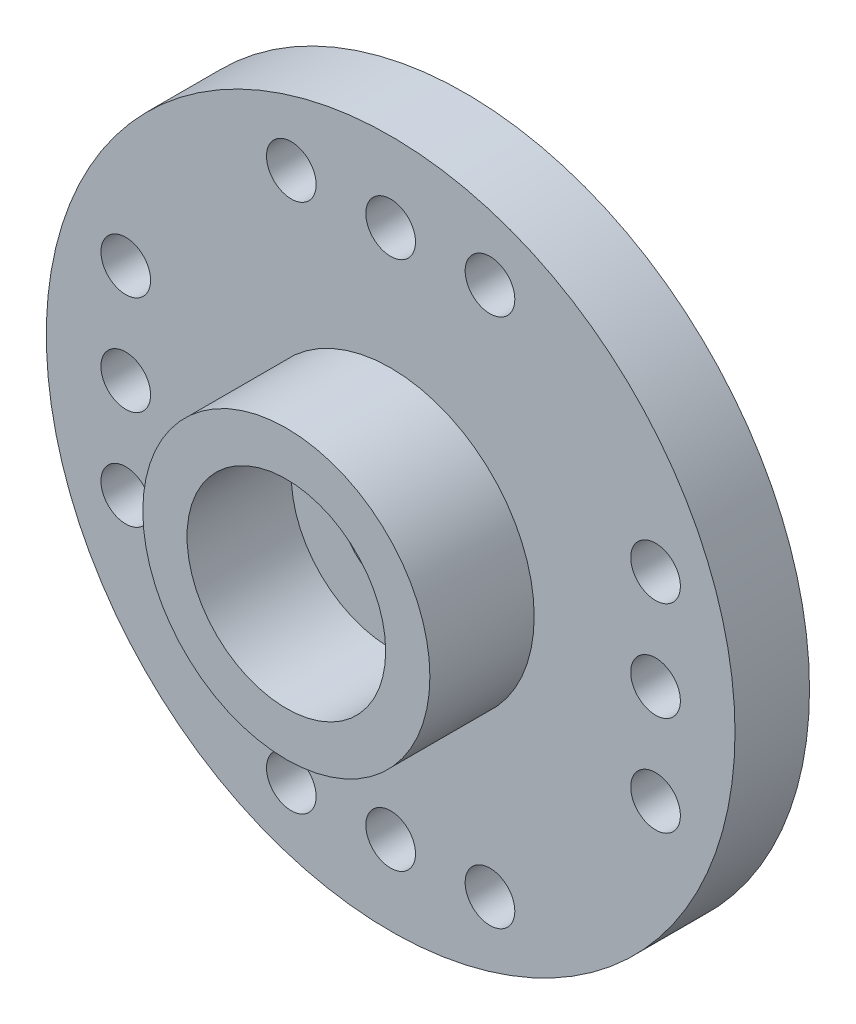
ISO-10303-21;
HEADER;
FILE_DESCRIPTION(('STEP AP214'),'2;1');
FILE_NAME('part.step','',(''),(''),'','','');
FILE_SCHEMA(('AUTOMOTIVE_DESIGN { 1 0 10303 214 1 1 1 1 }'));
ENDSEC;
DATA;
#1=APPLICATION_CONTEXT('core data for automotive mechanical design processes');
#2=APPLICATION_PROTOCOL_DEFINITION('international standard','automotive_design',2000,#1);
#3=PRODUCT_CONTEXT('',#1,'mechanical');
#4=PRODUCT('Part','Part','',(#3));
#5=PRODUCT_RELATED_PRODUCT_CATEGORY('part','',(#4));
#6=PRODUCT_DEFINITION_FORMATION('','',#4);
#7=PRODUCT_DEFINITION_CONTEXT('part definition',#1,'design');
#8=PRODUCT_DEFINITION('design','',#6,#7);
#9=PRODUCT_DEFINITION_SHAPE('','',#8);
#10=(LENGTH_UNIT() NAMED_UNIT(*) SI_UNIT(.MILLI.,.METRE.));
#11=(NAMED_UNIT(*) PLANE_ANGLE_UNIT() SI_UNIT($,.RADIAN.));
#12=(NAMED_UNIT(*) SI_UNIT($,.STERADIAN.) SOLID_ANGLE_UNIT());
#13=UNCERTAINTY_MEASURE_WITH_UNIT(LENGTH_MEASURE(1.E-05),#10,'distance_accuracy_value','');
#14=(GEOMETRIC_REPRESENTATION_CONTEXT(3) GLOBAL_UNCERTAINTY_ASSIGNED_CONTEXT((#13)) GLOBAL_UNIT_ASSIGNED_CONTEXT((#10,
#11,#12)) REPRESENTATION_CONTEXT('',''));
#15=CARTESIAN_POINT('',(0.,0.,0.));
#16=DIRECTION('',(0.,0.,1.));
#17=DIRECTION('',(1.,0.,0.));
#18=AXIS2_PLACEMENT_3D('',#15,#16,#17);
#19=CARTESIAN_POINT('',(0.,0.,2.25));
#20=DIRECTION('',(0.,0.,-1.));
#21=DIRECTION('',(-1.,0.,0.));
#22=AXIS2_PLACEMENT_3D('',#19,#20,#21);
#23=CYLINDRICAL_SURFACE('',#22,10.4);
#24=CARTESIAN_POINT('',(0.,0.,2.25));
#25=DIRECTION('',(0.,0.,1.));
#26=DIRECTION('',(1.,0.,0.));
#27=AXIS2_PLACEMENT_3D('',#24,#25,#26);
#28=CIRCLE('',#27,10.4);
#29=CARTESIAN_POINT('',(10.4,0.,2.25));
#30=VERTEX_POINT('',#29);
#31=EDGE_CURVE('E38',#30,#30,#28,.T.);
#32=ORIENTED_EDGE('',*,*,#31,.F.);
#33=EDGE_LOOP('',(#32));
#34=FACE_BOUND('',#33,.T.);
#35=CARTESIAN_POINT('',(0.,0.,0.));
#36=DIRECTION('',(0.,0.,1.));
#37=DIRECTION('',(1.,0.,0.));
#38=AXIS2_PLACEMENT_3D('',#35,#36,#37);
#39=CIRCLE('',#38,10.4);
#40=CARTESIAN_POINT('',(10.4,0.,0.));
#41=VERTEX_POINT('',#40);
#42=EDGE_CURVE('E43',#41,#41,#39,.T.);
#43=ORIENTED_EDGE('',*,*,#42,.T.);
#44=EDGE_LOOP('',(#43));
#45=FACE_BOUND('',#44,.T.);
#46=ADVANCED_FACE('F31',(#34,#45),#23,.T.);
#47=CARTESIAN_POINT('',(0.,0.,2.25));
#48=DIRECTION('',(0.,0.,1.));
#49=DIRECTION('',(1.,0.,0.));
#50=AXIS2_PLACEMENT_3D('',#47,#48,#49);
#51=PLANE('',#50);
#52=CARTESIAN_POINT('',(-7.9999999999994,-3.00000000000077,2.25));
#53=DIRECTION('',(0.,0.,1.));
#54=DIRECTION('',(1.,0.,0.));
#55=AXIS2_PLACEMENT_3D('',#52,#53,#54);
#56=CIRCLE('',#55,0.750000000000998);
#57=CARTESIAN_POINT('',(-7.24999999999841,-3.00000000000077,2.25));
#58=VERTEX_POINT('',#57);
#59=EDGE_CURVE('E235',#58,#58,#56,.T.);
#60=ORIENTED_EDGE('',*,*,#59,.F.);
#61=EDGE_LOOP('',(#60));
#62=FACE_BOUND('',#61,.T.);
#63=CARTESIAN_POINT('',(-7.99999999999941,2.99999999999923,2.25));
#64=DIRECTION('',(0.,0.,1.));
#65=DIRECTION('',(1.,0.,0.));
#66=AXIS2_PLACEMENT_3D('',#63,#64,#65);
#67=CIRCLE('',#66,0.750000000000978);
#68=CARTESIAN_POINT('',(-7.24999999999843,2.99999999999923,2.25));
#69=VERTEX_POINT('',#68);
#70=EDGE_CURVE('E233',#69,#69,#67,.T.);
#71=ORIENTED_EDGE('',*,*,#70,.F.);
#72=EDGE_LOOP('',(#71));
#73=FACE_BOUND('',#72,.T.);
#74=CARTESIAN_POINT('',(-7.9999999999994,-7.66632617932908E-13,2.25));
#75=DIRECTION('',(0.,0.,1.));
#76=DIRECTION('',(1.,0.,0.));
#77=AXIS2_PLACEMENT_3D('',#74,#75,#76);
#78=CIRCLE('',#77,0.750000000000987);
#79=CARTESIAN_POINT('',(-7.24999999999842,-7.66632617932908E-13,2.25));
#80=VERTEX_POINT('',#79);
#81=EDGE_CURVE('E214',#80,#80,#78,.T.);
#82=ORIENTED_EDGE('',*,*,#81,.F.);
#83=EDGE_LOOP('',(#82));
#84=FACE_BOUND('',#83,.T.);
#85=CARTESIAN_POINT('',(3.,8.,2.25));
#86=DIRECTION('',(0.,0.,1.));
#87=DIRECTION('',(1.,0.,0.));
#88=AXIS2_PLACEMENT_3D('',#85,#86,#87);
#89=CIRCLE('',#88,0.750000000000001);
#90=CARTESIAN_POINT('',(3.75,8.,2.25));
#91=VERTEX_POINT('',#90);
#92=EDGE_CURVE('E220',#91,#91,#89,.T.);
#93=ORIENTED_EDGE('',*,*,#92,.F.);
#94=EDGE_LOOP('',(#93));
#95=FACE_BOUND('',#94,.T.);
#96=CARTESIAN_POINT('',(-3.,8.,2.25));
#97=DIRECTION('',(0.,0.,1.));
#98=DIRECTION('',(1.,0.,0.));
#99=AXIS2_PLACEMENT_3D('',#96,#97,#98);
#100=CIRCLE('',#99,0.750000000000001);
#101=CARTESIAN_POINT('',(-2.25,8.,2.25));
#102=VERTEX_POINT('',#101);
#103=EDGE_CURVE('E223',#102,#102,#100,.T.);
#104=ORIENTED_EDGE('',*,*,#103,.F.);
#105=EDGE_LOOP('',(#104));
#106=FACE_BOUND('',#105,.T.);
#107=CARTESIAN_POINT('',(8.00000000000077,5.95649999847863E-13,2.25));
#108=DIRECTION('',(0.,0.,1.));
#109=DIRECTION('',(1.,0.,0.));
#110=AXIS2_PLACEMENT_3D('',#107,#108,#109);
#111=CIRCLE('',#110,0.750000000000373);
#112=CARTESIAN_POINT('',(8.75000000000114,5.95649999847863E-13,2.25));
#113=VERTEX_POINT('',#112);
#114=EDGE_CURVE('E226',#113,#113,#111,.T.);
#115=ORIENTED_EDGE('',*,*,#114,.F.);
#116=EDGE_LOOP('',(#115));
#117=FACE_BOUND('',#116,.T.);
#118=CARTESIAN_POINT('',(8.00000000000077,-2.9999999999994,2.25));
#119=DIRECTION('',(0.,0.,1.));
#120=DIRECTION('',(1.,0.,0.));
#121=AXIS2_PLACEMENT_3D('',#118,#119,#120);
#122=CIRCLE('',#121,0.75000000000037);
#123=CARTESIAN_POINT('',(8.75000000000114,-2.9999999999994,2.25));
#124=VERTEX_POINT('',#123);
#125=EDGE_CURVE('E218',#124,#124,#122,.T.);
#126=ORIENTED_EDGE('',*,*,#125,.F.);
#127=EDGE_LOOP('',(#126));
#128=FACE_BOUND('',#127,.T.);
#129=CARTESIAN_POINT('',(3.00000000000136,-8.00000000000017,2.25));
#130=DIRECTION('',(0.,0.,1.));
#131=DIRECTION('',(1.,0.,0.));
#132=AXIS2_PLACEMENT_3D('',#129,#130,#131);
#133=CIRCLE('',#132,0.750000000001312);
#134=CARTESIAN_POINT('',(3.75000000000267,-8.00000000000017,2.25));
#135=VERTEX_POINT('',#134);
#136=EDGE_CURVE('E208',#135,#135,#133,.T.);
#137=ORIENTED_EDGE('',*,*,#136,.F.);
#138=EDGE_LOOP('',(#137));
#139=FACE_BOUND('',#138,.T.);
#140=CARTESIAN_POINT('',(-2.99999999999864,-8.00000000000017,2.25));
#141=DIRECTION('',(0.,0.,1.));
#142=DIRECTION('',(1.,0.,0.));
#143=AXIS2_PLACEMENT_3D('',#140,#141,#142);
#144=CIRCLE('',#143,0.7500000000013);
#145=CARTESIAN_POINT('',(-2.24999999999734,-8.00000000000017,2.25));
#146=VERTEX_POINT('',#145);
#147=EDGE_CURVE('E191',#146,#146,#144,.T.);
#148=ORIENTED_EDGE('',*,*,#147,.F.);
#149=EDGE_LOOP('',(#148));
#150=FACE_BOUND('',#149,.T.);
#151=CARTESIAN_POINT('',(1.36130290034145E-12,-8.00000000000017,2.25));
#152=DIRECTION('',(0.,0.,1.));
#153=DIRECTION('',(1.,0.,0.));
#154=AXIS2_PLACEMENT_3D('',#151,#152,#153);
#155=CIRCLE('',#154,0.750000000001306);
#156=CARTESIAN_POINT('',(0.750000000002667,-8.00000000000017,2.25));
#157=VERTEX_POINT('',#156);
#158=EDGE_CURVE('E207',#157,#157,#155,.T.);
#159=ORIENTED_EDGE('',*,*,#158,.F.);
#160=EDGE_LOOP('',(#159));
#161=FACE_BOUND('',#160,.T.);
#162=CARTESIAN_POINT('',(8.00000000000076,3.0000000000006,2.25));
#163=DIRECTION('',(0.,0.,1.));
#164=DIRECTION('',(1.,0.,0.));
#165=AXIS2_PLACEMENT_3D('',#162,#163,#164);
#166=CIRCLE('',#165,0.750000000000377);
#167=CARTESIAN_POINT('',(8.75000000000114,3.0000000000006,2.25));
#168=VERTEX_POINT('',#167);
#169=EDGE_CURVE('E211',#168,#168,#166,.T.);
#170=ORIENTED_EDGE('',*,*,#169,.F.);
#171=EDGE_LOOP('',(#170));
#172=FACE_BOUND('',#171,.T.);
#173=CARTESIAN_POINT('',(0.,8.,2.25));
#174=DIRECTION('',(0.,0.,1.));
#175=DIRECTION('',(1.,0.,0.));
#176=AXIS2_PLACEMENT_3D('',#173,#174,#175);
#177=CIRCLE('',#176,0.75);
#178=CARTESIAN_POINT('',(0.75,8.,2.25));
#179=VERTEX_POINT('',#178);
#180=EDGE_CURVE('E56',#179,#179,#177,.T.);
#181=ORIENTED_EDGE('',*,*,#180,.F.);
#182=EDGE_LOOP('',(#181));
#183=FACE_BOUND('',#182,.T.);
#184=CARTESIAN_POINT('',(0.,0.,2.25));
#185=DIRECTION('',(0.,0.,1.));
#186=DIRECTION('',(1.,0.,0.));
#187=AXIS2_PLACEMENT_3D('',#184,#185,#186);
#188=CIRCLE('',#187,4.335);
#189=CARTESIAN_POINT('',(4.335,0.,2.25));
#190=VERTEX_POINT('',#189);
#191=EDGE_CURVE('E98',#190,#190,#188,.T.);
#192=ORIENTED_EDGE('',*,*,#191,.F.);
#193=EDGE_LOOP('',(#192));
#194=FACE_BOUND('',#193,.T.);
#195=ORIENTED_EDGE('',*,*,#31,.T.);
#196=EDGE_LOOP('',(#195));
#197=FACE_BOUND('',#196,.T.);
#198=ADVANCED_FACE('F107',(#62,#73,#84,#95,#106,#117,#128,#139,#150,#161,#172,#183,#194,#197),
#51,.T.);
#199=CARTESIAN_POINT('',(0.,0.,0.));
#200=DIRECTION('',(0.,0.,1.));
#201=DIRECTION('',(1.,0.,0.));
#202=AXIS2_PLACEMENT_3D('',#199,#200,#201);
#203=PLANE('',#202);
#204=CARTESIAN_POINT('',(-7.9999999999994,-3.00000000000077,0.));
#205=DIRECTION('',(0.,0.,1.));
#206=DIRECTION('',(1.,0.,0.));
#207=AXIS2_PLACEMENT_3D('',#204,#205,#206);
#208=CIRCLE('',#207,0.750000000000998);
#209=CARTESIAN_POINT('',(-7.24999999999841,-3.00000000000077,0.));
#210=VERTEX_POINT('',#209);
#211=EDGE_CURVE('E34',#210,#210,#208,.T.);
#212=ORIENTED_EDGE('',*,*,#211,.T.);
#213=EDGE_LOOP('',(#212));
#214=FACE_BOUND('',#213,.T.);
#215=CARTESIAN_POINT('',(-7.99999999999941,2.99999999999923,0.));
#216=DIRECTION('',(0.,0.,1.));
#217=DIRECTION('',(1.,0.,0.));
#218=AXIS2_PLACEMENT_3D('',#215,#216,#217);
#219=CIRCLE('',#218,0.750000000000978);
#220=CARTESIAN_POINT('',(-7.24999999999843,2.99999999999923,0.));
#221=VERTEX_POINT('',#220);
#222=EDGE_CURVE('E82',#221,#221,#219,.T.);
#223=ORIENTED_EDGE('',*,*,#222,.T.);
#224=EDGE_LOOP('',(#223));
#225=FACE_BOUND('',#224,.T.);
#226=CARTESIAN_POINT('',(-7.9999999999994,-7.66632617932908E-13,0.));
#227=DIRECTION('',(0.,0.,1.));
#228=DIRECTION('',(1.,0.,0.));
#229=AXIS2_PLACEMENT_3D('',#226,#227,#228);
#230=CIRCLE('',#229,0.750000000000987);
#231=CARTESIAN_POINT('',(-7.24999999999842,-7.66632617932908E-13,0.));
#232=VERTEX_POINT('',#231);
#233=EDGE_CURVE('E80',#232,#232,#230,.T.);
#234=ORIENTED_EDGE('',*,*,#233,.T.);
#235=EDGE_LOOP('',(#234));
#236=FACE_BOUND('',#235,.T.);
#237=CARTESIAN_POINT('',(3.,8.,0.));
#238=DIRECTION('',(0.,0.,1.));
#239=DIRECTION('',(1.,0.,0.));
#240=AXIS2_PLACEMENT_3D('',#237,#238,#239);
#241=CIRCLE('',#240,0.750000000000001);
#242=CARTESIAN_POINT('',(3.75,8.,0.));
#243=VERTEX_POINT('',#242);
#244=EDGE_CURVE('E77',#243,#243,#241,.T.);
#245=ORIENTED_EDGE('',*,*,#244,.T.);
#246=EDGE_LOOP('',(#245));
#247=FACE_BOUND('',#246,.T.);
#248=CARTESIAN_POINT('',(-3.,8.,0.));
#249=DIRECTION('',(0.,0.,1.));
#250=DIRECTION('',(1.,0.,0.));
#251=AXIS2_PLACEMENT_3D('',#248,#249,#250);
#252=CIRCLE('',#251,0.750000000000001);
#253=CARTESIAN_POINT('',(-2.25,8.,0.));
#254=VERTEX_POINT('',#253);
#255=EDGE_CURVE('E74',#254,#254,#252,.T.);
#256=ORIENTED_EDGE('',*,*,#255,.T.);
#257=EDGE_LOOP('',(#256));
#258=FACE_BOUND('',#257,.T.);
#259=CARTESIAN_POINT('',(8.00000000000077,5.95649999847863E-13,0.));
#260=DIRECTION('',(0.,0.,1.));
#261=DIRECTION('',(1.,0.,0.));
#262=AXIS2_PLACEMENT_3D('',#259,#260,#261);
#263=CIRCLE('',#262,0.750000000000373);
#264=CARTESIAN_POINT('',(8.75000000000114,5.95649999847863E-13,0.));
#265=VERTEX_POINT('',#264);
#266=EDGE_CURVE('E71',#265,#265,#263,.T.);
#267=ORIENTED_EDGE('',*,*,#266,.T.);
#268=EDGE_LOOP('',(#267));
#269=FACE_BOUND('',#268,.T.);
#270=CARTESIAN_POINT('',(8.00000000000077,-2.9999999999994,0.));
#271=DIRECTION('',(0.,0.,1.));
#272=DIRECTION('',(1.,0.,0.));
#273=AXIS2_PLACEMENT_3D('',#270,#271,#272);
#274=CIRCLE('',#273,0.75000000000037);
#275=CARTESIAN_POINT('',(8.75000000000114,-2.9999999999994,0.));
#276=VERTEX_POINT('',#275);
#277=EDGE_CURVE('E68',#276,#276,#274,.T.);
#278=ORIENTED_EDGE('',*,*,#277,.T.);
#279=EDGE_LOOP('',(#278));
#280=FACE_BOUND('',#279,.T.);
#281=CARTESIAN_POINT('',(3.00000000000136,-8.00000000000017,0.));
#282=DIRECTION('',(0.,0.,1.));
#283=DIRECTION('',(1.,0.,0.));
#284=AXIS2_PLACEMENT_3D('',#281,#282,#283);
#285=CIRCLE('',#284,0.750000000001312);
#286=CARTESIAN_POINT('',(3.75000000000267,-8.00000000000017,0.));
#287=VERTEX_POINT('',#286);
#288=EDGE_CURVE('E65',#287,#287,#285,.T.);
#289=ORIENTED_EDGE('',*,*,#288,.T.);
#290=EDGE_LOOP('',(#289));
#291=FACE_BOUND('',#290,.T.);
#292=CARTESIAN_POINT('',(-2.99999999999864,-8.00000000000017,0.));
#293=DIRECTION('',(0.,0.,1.));
#294=DIRECTION('',(1.,0.,0.));
#295=AXIS2_PLACEMENT_3D('',#292,#293,#294);
#296=CIRCLE('',#295,0.7500000000013);
#297=CARTESIAN_POINT('',(-2.24999999999734,-8.00000000000017,0.));
#298=VERTEX_POINT('',#297);
#299=EDGE_CURVE('E62',#298,#298,#296,.T.);
#300=ORIENTED_EDGE('',*,*,#299,.T.);
#301=EDGE_LOOP('',(#300));
#302=FACE_BOUND('',#301,.T.);
#303=CARTESIAN_POINT('',(1.36130290034145E-12,-8.00000000000017,0.));
#304=DIRECTION('',(0.,0.,1.));
#305=DIRECTION('',(1.,0.,0.));
#306=AXIS2_PLACEMENT_3D('',#303,#304,#305);
#307=CIRCLE('',#306,0.750000000001306);
#308=CARTESIAN_POINT('',(0.750000000002667,-8.00000000000017,0.));
#309=VERTEX_POINT('',#308);
#310=EDGE_CURVE('E59',#309,#309,#307,.T.);
#311=ORIENTED_EDGE('',*,*,#310,.T.);
#312=EDGE_LOOP('',(#311));
#313=FACE_BOUND('',#312,.T.);
#314=CARTESIAN_POINT('',(8.00000000000076,3.0000000000006,0.));
#315=DIRECTION('',(0.,0.,1.));
#316=DIRECTION('',(1.,0.,0.));
#317=AXIS2_PLACEMENT_3D('',#314,#315,#316);
#318=CIRCLE('',#317,0.750000000000377);
#319=CARTESIAN_POINT('',(8.75000000000114,3.0000000000006,0.));
#320=VERTEX_POINT('',#319);
#321=EDGE_CURVE('E55',#320,#320,#318,.T.);
#322=ORIENTED_EDGE('',*,*,#321,.T.);
#323=EDGE_LOOP('',(#322));
#324=FACE_BOUND('',#323,.T.);
#325=CARTESIAN_POINT('',(0.,8.,0.));
#326=DIRECTION('',(0.,0.,1.));
#327=DIRECTION('',(1.,0.,0.));
#328=AXIS2_PLACEMENT_3D('',#325,#326,#327);
#329=CIRCLE('',#328,0.75);
#330=CARTESIAN_POINT('',(0.75,8.,0.));
#331=VERTEX_POINT('',#330);
#332=EDGE_CURVE('E52',#331,#331,#329,.T.);
#333=ORIENTED_EDGE('',*,*,#332,.T.);
#334=EDGE_LOOP('',(#333));
#335=FACE_BOUND('',#334,.T.);
#336=CARTESIAN_POINT('',(0.,0.,0.));
#337=DIRECTION('',(0.,0.,1.));
#338=DIRECTION('',(1.,0.,0.));
#339=AXIS2_PLACEMENT_3D('',#336,#337,#338);
#340=CIRCLE('',#339,1.5);
#341=CARTESIAN_POINT('',(1.5,0.,0.));
#342=VERTEX_POINT('',#341);
#343=EDGE_CURVE('E47',#342,#342,#340,.T.);
#344=ORIENTED_EDGE('',*,*,#343,.T.);
#345=EDGE_LOOP('',(#344));
#346=FACE_BOUND('',#345,.T.);
#347=ORIENTED_EDGE('',*,*,#42,.F.);
#348=EDGE_LOOP('',(#347));
#349=FACE_BOUND('',#348,.T.);
#350=ADVANCED_FACE('F110',(#214,#225,#236,#247,#258,#269,#280,#291,#302,#313,#324,#335,#346,
#349),#203,.F.);
#351=CARTESIAN_POINT('',(0.,0.,5.4));
#352=DIRECTION('',(0.,0.,1.));
#353=DIRECTION('',(1.,0.,0.));
#354=AXIS2_PLACEMENT_3D('',#351,#352,#353);
#355=PLANE('',#354);
#356=CARTESIAN_POINT('',(0.,0.,5.4));
#357=DIRECTION('',(0.,0.,1.));
#358=DIRECTION('',(1.,0.,0.));
#359=AXIS2_PLACEMENT_3D('',#356,#357,#358);
#360=CIRCLE('',#359,4.335);
#361=CARTESIAN_POINT('',(4.335,0.,5.4));
#362=VERTEX_POINT('',#361);
#363=EDGE_CURVE('E99',#362,#362,#360,.T.);
#364=ORIENTED_EDGE('',*,*,#363,.T.);
#365=EDGE_LOOP('',(#364));
#366=FACE_BOUND('',#365,.T.);
#367=CARTESIAN_POINT('',(0.,0.,5.4));
#368=DIRECTION('',(0.,0.,1.));
#369=DIRECTION('',(1.,0.,0.));
#370=AXIS2_PLACEMENT_3D('',#367,#368,#369);
#371=CIRCLE('',#370,3.);
#372=CARTESIAN_POINT('',(3.,0.,5.4));
#373=VERTEX_POINT('',#372);
#374=EDGE_CURVE('E50',#373,#373,#371,.T.);
#375=ORIENTED_EDGE('',*,*,#374,.F.);
#376=EDGE_LOOP('',(#375));
#377=FACE_BOUND('',#376,.T.);
#378=ADVANCED_FACE('F122',(#366,#377),#355,.T.);
#379=CARTESIAN_POINT('',(0.,0.,5.4));
#380=DIRECTION('',(0.,0.,-1.));
#381=DIRECTION('',(-1.,0.,0.));
#382=AXIS2_PLACEMENT_3D('',#379,#380,#381);
#383=CYLINDRICAL_SURFACE('',#382,4.335);
#384=ORIENTED_EDGE('',*,*,#363,.F.);
#385=EDGE_LOOP('',(#384));
#386=FACE_BOUND('',#385,.T.);
#387=ORIENTED_EDGE('',*,*,#191,.T.);
#388=EDGE_LOOP('',(#387));
#389=FACE_BOUND('',#388,.T.);
#390=ADVANCED_FACE('F105',(#386,#389),#383,.T.);
#391=CARTESIAN_POINT('',(0.,0.,5.4));
#392=DIRECTION('',(0.,0.,-1.));
#393=DIRECTION('',(-1.,0.,0.));
#394=AXIS2_PLACEMENT_3D('',#391,#392,#393);
#395=CYLINDRICAL_SURFACE('',#394,3.);
#396=ORIENTED_EDGE('',*,*,#374,.T.);
#397=EDGE_LOOP('',(#396));
#398=FACE_BOUND('',#397,.T.);
#399=CARTESIAN_POINT('',(0.,0.,2.25));
#400=DIRECTION('',(0.,0.,1.));
#401=DIRECTION('',(1.,0.,0.));
#402=AXIS2_PLACEMENT_3D('',#399,#400,#401);
#403=CIRCLE('',#402,3.);
#404=CARTESIAN_POINT('',(3.,0.,2.25));
#405=VERTEX_POINT('',#404);
#406=EDGE_CURVE('E10',#405,#405,#403,.F.);
#407=ORIENTED_EDGE('',*,*,#406,.T.);
#408=EDGE_LOOP('',(#407));
#409=FACE_BOUND('',#408,.T.);
#410=ADVANCED_FACE('F130',(#398,#409),#395,.F.);
#411=CARTESIAN_POINT('',(0.,0.,2.25));
#412=DIRECTION('',(0.,0.,1.));
#413=DIRECTION('',(1.,0.,0.));
#414=AXIS2_PLACEMENT_3D('',#411,#412,#413);
#415=CIRCLE('',#414,1.5);
#416=CARTESIAN_POINT('',(1.5,0.,2.25));
#417=VERTEX_POINT('',#416);
#418=EDGE_CURVE('E51',#417,#417,#415,.T.);
#419=ORIENTED_EDGE('',*,*,#418,.F.);
#420=EDGE_LOOP('',(#419));
#421=FACE_BOUND('',#420,.T.);
#422=ORIENTED_EDGE('',*,*,#406,.F.);
#423=EDGE_LOOP('',(#422));
#424=FACE_BOUND('',#423,.T.);
#425=ADVANCED_FACE('F113',(#421,#424),#51,.T.);
#426=CARTESIAN_POINT('',(0.,0.,-0.900000000000001));
#427=DIRECTION('',(0.,0.,1.));
#428=DIRECTION('',(1.,0.,0.));
#429=AXIS2_PLACEMENT_3D('',#426,#427,#428);
#430=CYLINDRICAL_SURFACE('',#429,1.5);
#431=ORIENTED_EDGE('',*,*,#418,.T.);
#432=EDGE_LOOP('',(#431));
#433=FACE_BOUND('',#432,.T.);
#434=ORIENTED_EDGE('',*,*,#343,.F.);
#435=EDGE_LOOP('',(#434));
#436=FACE_BOUND('',#435,.T.);
#437=ADVANCED_FACE('F136',(#433,#436),#430,.F.);
#438=CARTESIAN_POINT('',(0.,8.,-0.900000000000001));
#439=DIRECTION('',(0.,0.,1.));
#440=DIRECTION('',(1.,0.,0.));
#441=AXIS2_PLACEMENT_3D('',#438,#439,#440);
#442=CYLINDRICAL_SURFACE('',#441,0.75);
#443=ORIENTED_EDGE('',*,*,#180,.T.);
#444=EDGE_LOOP('',(#443));
#445=FACE_BOUND('',#444,.T.);
#446=ORIENTED_EDGE('',*,*,#332,.F.);
#447=EDGE_LOOP('',(#446));
#448=FACE_BOUND('',#447,.T.);
#449=ADVANCED_FACE('F139',(#445,#448),#442,.F.);
#450=CARTESIAN_POINT('',(8.00000000000076,3.0000000000006,-0.900000000000001));
#451=DIRECTION('',(0.,0.,1.));
#452=DIRECTION('',(1.,0.,0.));
#453=AXIS2_PLACEMENT_3D('',#450,#451,#452);
#454=CYLINDRICAL_SURFACE('',#453,0.750000000000377);
#455=ORIENTED_EDGE('',*,*,#169,.T.);
#456=EDGE_LOOP('',(#455));
#457=FACE_BOUND('',#456,.T.);
#458=ORIENTED_EDGE('',*,*,#321,.F.);
#459=EDGE_LOOP('',(#458));
#460=FACE_BOUND('',#459,.T.);
#461=ADVANCED_FACE('F142',(#457,#460),#454,.F.);
#462=CARTESIAN_POINT('',(1.36130290034145E-12,-8.00000000000017,-0.900000000000001));
#463=DIRECTION('',(0.,0.,1.));
#464=DIRECTION('',(1.,0.,0.));
#465=AXIS2_PLACEMENT_3D('',#462,#463,#464);
#466=CYLINDRICAL_SURFACE('',#465,0.750000000001306);
#467=ORIENTED_EDGE('',*,*,#158,.T.);
#468=EDGE_LOOP('',(#467));
#469=FACE_BOUND('',#468,.T.);
#470=ORIENTED_EDGE('',*,*,#310,.F.);
#471=EDGE_LOOP('',(#470));
#472=FACE_BOUND('',#471,.T.);
#473=ADVANCED_FACE('F173',(#469,#472),#466,.F.);
#474=CARTESIAN_POINT('',(-2.99999999999864,-8.00000000000017,-0.900000000000001));
#475=DIRECTION('',(0.,0.,1.));
#476=DIRECTION('',(1.,0.,0.));
#477=AXIS2_PLACEMENT_3D('',#474,#475,#476);
#478=CYLINDRICAL_SURFACE('',#477,0.7500000000013);
#479=ORIENTED_EDGE('',*,*,#147,.T.);
#480=EDGE_LOOP('',(#479));
#481=FACE_BOUND('',#480,.T.);
#482=ORIENTED_EDGE('',*,*,#299,.F.);
#483=EDGE_LOOP('',(#482));
#484=FACE_BOUND('',#483,.T.);
#485=ADVANCED_FACE('F176',(#481,#484),#478,.F.);
#486=CARTESIAN_POINT('',(3.00000000000136,-8.00000000000017,-0.900000000000001));
#487=DIRECTION('',(0.,0.,1.));
#488=DIRECTION('',(1.,0.,0.));
#489=AXIS2_PLACEMENT_3D('',#486,#487,#488);
#490=CYLINDRICAL_SURFACE('',#489,0.750000000001312);
#491=ORIENTED_EDGE('',*,*,#136,.T.);
#492=EDGE_LOOP('',(#491));
#493=FACE_BOUND('',#492,.T.);
#494=ORIENTED_EDGE('',*,*,#288,.F.);
#495=EDGE_LOOP('',(#494));
#496=FACE_BOUND('',#495,.T.);
#497=ADVANCED_FACE('F161',(#493,#496),#490,.F.);
#498=CARTESIAN_POINT('',(8.00000000000077,-2.9999999999994,-0.900000000000001));
#499=DIRECTION('',(0.,0.,1.));
#500=DIRECTION('',(1.,0.,0.));
#501=AXIS2_PLACEMENT_3D('',#498,#499,#500);
#502=CYLINDRICAL_SURFACE('',#501,0.75000000000037);
#503=ORIENTED_EDGE('',*,*,#125,.T.);
#504=EDGE_LOOP('',(#503));
#505=FACE_BOUND('',#504,.T.);
#506=ORIENTED_EDGE('',*,*,#277,.F.);
#507=EDGE_LOOP('',(#506));
#508=FACE_BOUND('',#507,.T.);
#509=ADVANCED_FACE('F157',(#505,#508),#502,.F.);
#510=CARTESIAN_POINT('',(8.00000000000077,5.95649999847863E-13,-0.900000000000001));
#511=DIRECTION('',(0.,0.,1.));
#512=DIRECTION('',(1.,0.,0.));
#513=AXIS2_PLACEMENT_3D('',#510,#511,#512);
#514=CYLINDRICAL_SURFACE('',#513,0.750000000000373);
#515=ORIENTED_EDGE('',*,*,#114,.T.);
#516=EDGE_LOOP('',(#515));
#517=FACE_BOUND('',#516,.T.);
#518=ORIENTED_EDGE('',*,*,#266,.F.);
#519=EDGE_LOOP('',(#518));
#520=FACE_BOUND('',#519,.T.);
#521=ADVANCED_FACE('F160',(#517,#520),#514,.F.);
#522=CARTESIAN_POINT('',(-3.,8.,-0.900000000000001));
#523=DIRECTION('',(0.,0.,1.));
#524=DIRECTION('',(1.,0.,0.));
#525=AXIS2_PLACEMENT_3D('',#522,#523,#524);
#526=CYLINDRICAL_SURFACE('',#525,0.750000000000001);
#527=ORIENTED_EDGE('',*,*,#103,.T.);
#528=EDGE_LOOP('',(#527));
#529=FACE_BOUND('',#528,.T.);
#530=ORIENTED_EDGE('',*,*,#255,.F.);
#531=EDGE_LOOP('',(#530));
#532=FACE_BOUND('',#531,.T.);
#533=ADVANCED_FACE('F165',(#529,#532),#526,.F.);
#534=CARTESIAN_POINT('',(3.,8.,-0.900000000000001));
#535=DIRECTION('',(0.,0.,1.));
#536=DIRECTION('',(1.,0.,0.));
#537=AXIS2_PLACEMENT_3D('',#534,#535,#536);
#538=CYLINDRICAL_SURFACE('',#537,0.750000000000001);
#539=ORIENTED_EDGE('',*,*,#92,.T.);
#540=EDGE_LOOP('',(#539));
#541=FACE_BOUND('',#540,.T.);
#542=ORIENTED_EDGE('',*,*,#244,.F.);
#543=EDGE_LOOP('',(#542));
#544=FACE_BOUND('',#543,.T.);
#545=ADVANCED_FACE('F155',(#541,#544),#538,.F.);
#546=CARTESIAN_POINT('',(-7.9999999999994,-7.66632617932908E-13,-0.900000000000001));
#547=DIRECTION('',(0.,0.,1.));
#548=DIRECTION('',(1.,0.,0.));
#549=AXIS2_PLACEMENT_3D('',#546,#547,#548);
#550=CYLINDRICAL_SURFACE('',#549,0.750000000000987);
#551=ORIENTED_EDGE('',*,*,#81,.T.);
#552=EDGE_LOOP('',(#551));
#553=FACE_BOUND('',#552,.T.);
#554=ORIENTED_EDGE('',*,*,#233,.F.);
#555=EDGE_LOOP('',(#554));
#556=FACE_BOUND('',#555,.T.);
#557=ADVANCED_FACE('F151',(#553,#556),#550,.F.);
#558=CARTESIAN_POINT('',(-7.99999999999941,2.99999999999923,-0.900000000000001));
#559=DIRECTION('',(0.,0.,1.));
#560=DIRECTION('',(1.,0.,0.));
#561=AXIS2_PLACEMENT_3D('',#558,#559,#560);
#562=CYLINDRICAL_SURFACE('',#561,0.750000000000978);
#563=ORIENTED_EDGE('',*,*,#70,.T.);
#564=EDGE_LOOP('',(#563));
#565=FACE_BOUND('',#564,.T.);
#566=ORIENTED_EDGE('',*,*,#222,.F.);
#567=EDGE_LOOP('',(#566));
#568=FACE_BOUND('',#567,.T.);
#569=ADVANCED_FACE('F147',(#565,#568),#562,.F.);
#570=CARTESIAN_POINT('',(-7.9999999999994,-3.00000000000077,-0.900000000000001));
#571=DIRECTION('',(0.,0.,1.));
#572=DIRECTION('',(1.,0.,0.));
#573=AXIS2_PLACEMENT_3D('',#570,#571,#572);
#574=CYLINDRICAL_SURFACE('',#573,0.750000000000998);
#575=ORIENTED_EDGE('',*,*,#59,.T.);
#576=EDGE_LOOP('',(#575));
#577=FACE_BOUND('',#576,.T.);
#578=ORIENTED_EDGE('',*,*,#211,.F.);
#579=EDGE_LOOP('',(#578));
#580=FACE_BOUND('',#579,.T.);
#581=ADVANCED_FACE('F144',(#577,#580),#574,.F.);
#582=CLOSED_SHELL('',(#46,#198,#350,#378,#390,#410,#425,#437,#449,#461,#473,#485,#497,#509,#521,
#533,#545,#557,#569,#581));
#583=MANIFOLD_SOLID_BREP('B2',#582);
#584=ADVANCED_BREP_SHAPE_REPRESENTATION('',(#18,#583),#14);
#585=SHAPE_DEFINITION_REPRESENTATION(#9,#584);
ENDSEC;
END-ISO-10303-21;
